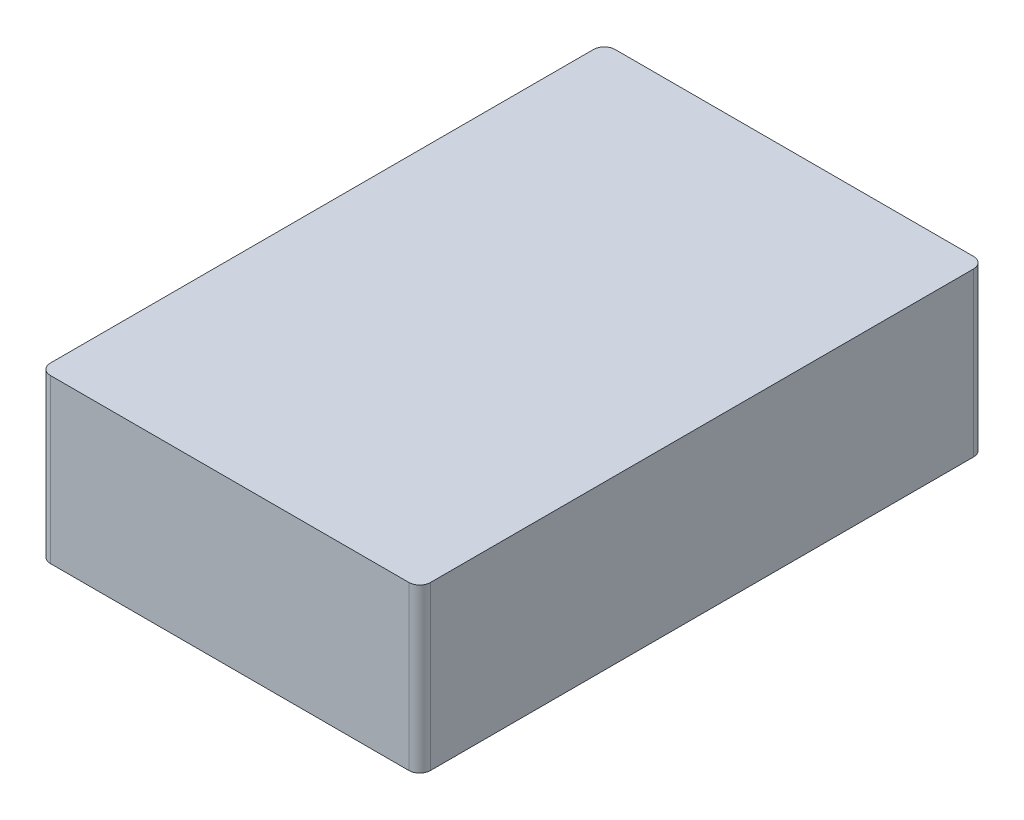
ISO-10303-21;
HEADER;
FILE_DESCRIPTION(('STEP AP214'),'2;1');
FILE_NAME('part.step','',(''),(''),'','','');
FILE_SCHEMA(('AUTOMOTIVE_DESIGN { 1 0 10303 214 1 1 1 1 }'));
ENDSEC;
DATA;
#1=APPLICATION_CONTEXT('core data for automotive mechanical design processes');
#2=APPLICATION_PROTOCOL_DEFINITION('international standard','automotive_design',2000,#1);
#3=PRODUCT_CONTEXT('',#1,'mechanical');
#4=PRODUCT('Part','Part','',(#3));
#5=PRODUCT_RELATED_PRODUCT_CATEGORY('part','',(#4));
#6=PRODUCT_DEFINITION_FORMATION('','',#4);
#7=PRODUCT_DEFINITION_CONTEXT('part definition',#1,'design');
#8=PRODUCT_DEFINITION('design','',#6,#7);
#9=PRODUCT_DEFINITION_SHAPE('','',#8);
#10=(LENGTH_UNIT() NAMED_UNIT(*) SI_UNIT(.MILLI.,.METRE.));
#11=(NAMED_UNIT(*) PLANE_ANGLE_UNIT() SI_UNIT($,.RADIAN.));
#12=(NAMED_UNIT(*) SI_UNIT($,.STERADIAN.) SOLID_ANGLE_UNIT());
#13=UNCERTAINTY_MEASURE_WITH_UNIT(LENGTH_MEASURE(1.E-05),#10,'distance_accuracy_value','');
#14=(GEOMETRIC_REPRESENTATION_CONTEXT(3) GLOBAL_UNCERTAINTY_ASSIGNED_CONTEXT((#13)) GLOBAL_UNIT_ASSIGNED_CONTEXT((#10,
#11,#12)) REPRESENTATION_CONTEXT('',''));
#15=CARTESIAN_POINT('',(0.,0.,0.));
#16=DIRECTION('',(0.,0.,1.));
#17=DIRECTION('',(1.,0.,0.));
#18=AXIS2_PLACEMENT_3D('',#15,#16,#17);
#19=CARTESIAN_POINT('',(17.5,15.,-26.));
#20=DIRECTION('',(-1.,0.,0.));
#21=DIRECTION('',(0.,0.,1.));
#22=AXIS2_PLACEMENT_3D('',#19,#20,#21);
#23=PLANE('',#22);
#24=DIRECTION('',(0.,0.,-1.));
#25=VECTOR('',#24,1.);
#26=CARTESIAN_POINT('',(17.5,0.,-26.));
#27=LINE('',#26,#25);
#28=CARTESIAN_POINT('',(17.5,0.,25.));
#29=VERTEX_POINT('',#28);
#30=CARTESIAN_POINT('',(17.5,0.,-25.));
#31=VERTEX_POINT('',#30);
#32=EDGE_CURVE('E140',#29,#31,#27,.T.);
#33=ORIENTED_EDGE('',*,*,#32,.T.);
#34=DIRECTION('',(0.,-1.,0.));
#35=VECTOR('',#34,1.);
#36=CARTESIAN_POINT('',(17.5,15.,-25.));
#37=LINE('',#36,#35);
#38=CARTESIAN_POINT('',(17.5,15.,-25.));
#39=VERTEX_POINT('',#38);
#40=EDGE_CURVE('E174',#31,#39,#37,.F.);
#41=ORIENTED_EDGE('',*,*,#40,.T.);
#42=DIRECTION('',(0.,0.,-1.));
#43=VECTOR('',#42,1.);
#44=CARTESIAN_POINT('',(17.5,15.,-26.));
#45=LINE('',#44,#43);
#46=CARTESIAN_POINT('',(17.5,15.,25.));
#47=VERTEX_POINT('',#46);
#48=EDGE_CURVE('E138',#47,#39,#45,.T.);
#49=ORIENTED_EDGE('',*,*,#48,.F.);
#50=DIRECTION('',(0.,-1.,0.));
#51=VECTOR('',#50,1.);
#52=CARTESIAN_POINT('',(17.5,15.,25.));
#53=LINE('',#52,#51);
#54=EDGE_CURVE('E170',#47,#29,#53,.T.);
#55=ORIENTED_EDGE('',*,*,#54,.T.);
#56=EDGE_LOOP('',(#33,#41,#49,#55));
#57=FACE_BOUND('',#56,.T.);
#58=ADVANCED_FACE('F39',(#57),#23,.F.);
#59=CARTESIAN_POINT('',(-17.5,15.,-26.));
#60=DIRECTION('',(0.,0.,1.));
#61=DIRECTION('',(1.,0.,0.));
#62=AXIS2_PLACEMENT_3D('',#59,#60,#61);
#63=PLANE('',#62);
#64=DIRECTION('',(-1.,0.,0.));
#65=VECTOR('',#64,1.);
#66=CARTESIAN_POINT('',(-17.5,0.,-26.));
#67=LINE('',#66,#65);
#68=CARTESIAN_POINT('',(16.5,0.,-26.));
#69=VERTEX_POINT('',#68);
#70=CARTESIAN_POINT('',(-16.5,0.,-26.));
#71=VERTEX_POINT('',#70);
#72=EDGE_CURVE('E134',#69,#71,#67,.T.);
#73=ORIENTED_EDGE('',*,*,#72,.T.);
#74=DIRECTION('',(0.,-1.,0.));
#75=VECTOR('',#74,1.);
#76=CARTESIAN_POINT('',(-16.5,15.,-26.));
#77=LINE('',#76,#75);
#78=CARTESIAN_POINT('',(-16.5,15.,-26.));
#79=VERTEX_POINT('',#78);
#80=EDGE_CURVE('E110',#71,#79,#77,.F.);
#81=ORIENTED_EDGE('',*,*,#80,.T.);
#82=DIRECTION('',(-1.,0.,0.));
#83=VECTOR('',#82,1.);
#84=CARTESIAN_POINT('',(-17.5,15.,-26.));
#85=LINE('',#84,#83);
#86=CARTESIAN_POINT('',(16.5,15.,-26.));
#87=VERTEX_POINT('',#86);
#88=EDGE_CURVE('E193',#87,#79,#85,.T.);
#89=ORIENTED_EDGE('',*,*,#88,.F.);
#90=DIRECTION('',(0.,-1.,0.));
#91=VECTOR('',#90,1.);
#92=CARTESIAN_POINT('',(16.5,15.,-26.));
#93=LINE('',#92,#91);
#94=EDGE_CURVE('E116',#87,#69,#93,.T.);
#95=ORIENTED_EDGE('',*,*,#94,.T.);
#96=EDGE_LOOP('',(#73,#81,#89,#95));
#97=FACE_BOUND('',#96,.T.);
#98=ADVANCED_FACE('F214',(#97),#63,.F.);
#99=CARTESIAN_POINT('',(-17.5,15.,-26.));
#100=DIRECTION('',(1.,0.,0.));
#101=DIRECTION('',(0.,0.,-1.));
#102=AXIS2_PLACEMENT_3D('',#99,#100,#101);
#103=PLANE('',#102);
#104=DIRECTION('',(0.,0.,1.));
#105=VECTOR('',#104,1.);
#106=CARTESIAN_POINT('',(-17.5,15.,-26.));
#107=LINE('',#106,#105);
#108=CARTESIAN_POINT('',(-17.5,15.,-25.));
#109=VERTEX_POINT('',#108);
#110=CARTESIAN_POINT('',(-17.5,15.,25.));
#111=VERTEX_POINT('',#110);
#112=EDGE_CURVE('E125',#109,#111,#107,.T.);
#113=ORIENTED_EDGE('',*,*,#112,.F.);
#114=DIRECTION('',(0.,-1.,0.));
#115=VECTOR('',#114,1.);
#116=CARTESIAN_POINT('',(-17.5,15.,-25.));
#117=LINE('',#116,#115);
#118=CARTESIAN_POINT('',(-17.5,0.,-25.));
#119=VERTEX_POINT('',#118);
#120=EDGE_CURVE('E109',#109,#119,#117,.T.);
#121=ORIENTED_EDGE('',*,*,#120,.T.);
#122=DIRECTION('',(0.,0.,1.));
#123=VECTOR('',#122,1.);
#124=CARTESIAN_POINT('',(-17.5,0.,-26.));
#125=LINE('',#124,#123);
#126=CARTESIAN_POINT('',(-17.5,0.,25.));
#127=VERTEX_POINT('',#126);
#128=EDGE_CURVE('E123',#119,#127,#125,.T.);
#129=ORIENTED_EDGE('',*,*,#128,.T.);
#130=DIRECTION('',(0.,-1.,0.));
#131=VECTOR('',#130,1.);
#132=CARTESIAN_POINT('',(-17.5,15.,25.));
#133=LINE('',#132,#131);
#134=EDGE_CURVE('E128',#127,#111,#133,.F.);
#135=ORIENTED_EDGE('',*,*,#134,.T.);
#136=EDGE_LOOP('',(#113,#121,#129,#135));
#137=FACE_BOUND('',#136,.T.);
#138=ADVANCED_FACE('F122',(#137),#103,.F.);
#139=CARTESIAN_POINT('',(-17.5,15.,26.));
#140=DIRECTION('',(0.,0.,-1.));
#141=DIRECTION('',(-1.,0.,0.));
#142=AXIS2_PLACEMENT_3D('',#139,#140,#141);
#143=PLANE('',#142);
#144=DIRECTION('',(1.,0.,0.));
#145=VECTOR('',#144,1.);
#146=CARTESIAN_POINT('',(-17.5,0.,26.));
#147=LINE('',#146,#145);
#148=CARTESIAN_POINT('',(-16.5,0.,26.));
#149=VERTEX_POINT('',#148);
#150=CARTESIAN_POINT('',(16.5,0.,26.));
#151=VERTEX_POINT('',#150);
#152=EDGE_CURVE('E133',#149,#151,#147,.T.);
#153=ORIENTED_EDGE('',*,*,#152,.T.);
#154=DIRECTION('',(0.,-1.,0.));
#155=VECTOR('',#154,1.);
#156=CARTESIAN_POINT('',(16.5,15.,26.));
#157=LINE('',#156,#155);
#158=CARTESIAN_POINT('',(16.5,15.,26.));
#159=VERTEX_POINT('',#158);
#160=EDGE_CURVE('E11',#151,#159,#157,.F.);
#161=ORIENTED_EDGE('',*,*,#160,.T.);
#162=DIRECTION('',(1.,0.,0.));
#163=VECTOR('',#162,1.);
#164=CARTESIAN_POINT('',(-17.5,15.,26.));
#165=LINE('',#164,#163);
#166=CARTESIAN_POINT('',(-16.5,15.,26.));
#167=VERTEX_POINT('',#166);
#168=EDGE_CURVE('E145',#167,#159,#165,.T.);
#169=ORIENTED_EDGE('',*,*,#168,.F.);
#170=DIRECTION('',(0.,-1.,0.));
#171=VECTOR('',#170,1.);
#172=CARTESIAN_POINT('',(-16.5,15.,26.));
#173=LINE('',#172,#171);
#174=EDGE_CURVE('E48',#167,#149,#173,.T.);
#175=ORIENTED_EDGE('',*,*,#174,.T.);
#176=EDGE_LOOP('',(#153,#161,#169,#175));
#177=FACE_BOUND('',#176,.T.);
#178=ADVANCED_FACE('F179',(#177),#143,.F.);
#179=CARTESIAN_POINT('',(0.,15.,0.));
#180=DIRECTION('',(0.,1.,0.));
#181=DIRECTION('',(0.,0.,1.));
#182=AXIS2_PLACEMENT_3D('',#179,#180,#181);
#183=PLANE('',#182);
#184=ORIENTED_EDGE('',*,*,#88,.T.);
#185=CARTESIAN_POINT('',(-16.5,15.,-25.));
#186=DIRECTION('',(0.,1.,0.));
#187=DIRECTION('',(0.,0.,1.));
#188=AXIS2_PLACEMENT_3D('',#185,#186,#187);
#189=CIRCLE('',#188,1.);
#190=EDGE_CURVE('E167',#79,#109,#189,.T.);
#191=ORIENTED_EDGE('',*,*,#190,.T.);
#192=ORIENTED_EDGE('',*,*,#112,.T.);
#193=CARTESIAN_POINT('',(-16.5,15.,25.));
#194=DIRECTION('',(0.,1.,0.));
#195=DIRECTION('',(0.,0.,1.));
#196=AXIS2_PLACEMENT_3D('',#193,#194,#195);
#197=CIRCLE('',#196,1.);
#198=EDGE_CURVE('E60',#111,#167,#197,.T.);
#199=ORIENTED_EDGE('',*,*,#198,.T.);
#200=ORIENTED_EDGE('',*,*,#168,.T.);
#201=CARTESIAN_POINT('',(16.5,15.,25.));
#202=DIRECTION('',(0.,1.,0.));
#203=DIRECTION('',(0.,0.,1.));
#204=AXIS2_PLACEMENT_3D('',#201,#202,#203);
#205=CIRCLE('',#204,1.);
#206=EDGE_CURVE('E161',#159,#47,#205,.T.);
#207=ORIENTED_EDGE('',*,*,#206,.T.);
#208=ORIENTED_EDGE('',*,*,#48,.T.);
#209=CARTESIAN_POINT('',(16.5,15.,-25.));
#210=DIRECTION('',(0.,1.,0.));
#211=DIRECTION('',(0.,0.,1.));
#212=AXIS2_PLACEMENT_3D('',#209,#210,#211);
#213=CIRCLE('',#212,1.);
#214=EDGE_CURVE('E164',#39,#87,#213,.T.);
#215=ORIENTED_EDGE('',*,*,#214,.T.);
#216=EDGE_LOOP('',(#184,#191,#192,#199,#200,#207,#208,#215));
#217=FACE_BOUND('',#216,.T.);
#218=ADVANCED_FACE('F203',(#217),#183,.T.);
#219=CARTESIAN_POINT('',(0.,0.,0.));
#220=DIRECTION('',(0.,1.,0.));
#221=DIRECTION('',(0.,0.,1.));
#222=AXIS2_PLACEMENT_3D('',#219,#220,#221);
#223=PLANE('',#222);
#224=ORIENTED_EDGE('',*,*,#128,.F.);
#225=CARTESIAN_POINT('',(-16.5,0.,-25.));
#226=DIRECTION('',(0.,1.,0.));
#227=DIRECTION('',(0.,0.,1.));
#228=AXIS2_PLACEMENT_3D('',#225,#226,#227);
#229=CIRCLE('',#228,1.);
#230=EDGE_CURVE('E105',#119,#71,#229,.F.);
#231=ORIENTED_EDGE('',*,*,#230,.T.);
#232=ORIENTED_EDGE('',*,*,#72,.F.);
#233=CARTESIAN_POINT('',(16.5,0.,-25.));
#234=DIRECTION('',(0.,1.,0.));
#235=DIRECTION('',(0.,0.,1.));
#236=AXIS2_PLACEMENT_3D('',#233,#234,#235);
#237=CIRCLE('',#236,1.);
#238=EDGE_CURVE('E117',#69,#31,#237,.F.);
#239=ORIENTED_EDGE('',*,*,#238,.T.);
#240=ORIENTED_EDGE('',*,*,#32,.F.);
#241=CARTESIAN_POINT('',(16.5,0.,25.));
#242=DIRECTION('',(0.,1.,0.));
#243=DIRECTION('',(0.,0.,1.));
#244=AXIS2_PLACEMENT_3D('',#241,#242,#243);
#245=CIRCLE('',#244,1.);
#246=EDGE_CURVE('E149',#29,#151,#245,.F.);
#247=ORIENTED_EDGE('',*,*,#246,.T.);
#248=ORIENTED_EDGE('',*,*,#152,.F.);
#249=CARTESIAN_POINT('',(-16.5,0.,25.));
#250=DIRECTION('',(0.,1.,0.));
#251=DIRECTION('',(0.,0.,1.));
#252=AXIS2_PLACEMENT_3D('',#249,#250,#251);
#253=CIRCLE('',#252,1.);
#254=EDGE_CURVE('E127',#149,#127,#253,.F.);
#255=ORIENTED_EDGE('',*,*,#254,.T.);
#256=EDGE_LOOP('',(#224,#231,#232,#239,#240,#247,#248,#255));
#257=FACE_BOUND('',#256,.T.);
#258=ADVANCED_FACE('F130',(#257),#223,.F.);
#259=CARTESIAN_POINT('',(-16.5,15.,-25.));
#260=DIRECTION('',(0.,-1.,0.));
#261=DIRECTION('',(0.,0.,-1.));
#262=AXIS2_PLACEMENT_3D('',#259,#260,#261);
#263=CYLINDRICAL_SURFACE('',#262,1.);
#264=ORIENTED_EDGE('',*,*,#190,.F.);
#265=ORIENTED_EDGE('',*,*,#80,.F.);
#266=ORIENTED_EDGE('',*,*,#230,.F.);
#267=ORIENTED_EDGE('',*,*,#120,.F.);
#268=EDGE_LOOP('',(#264,#265,#266,#267));
#269=FACE_BOUND('',#268,.T.);
#270=ADVANCED_FACE('F108',(#269),#263,.T.);
#271=CARTESIAN_POINT('',(16.5,15.,-25.));
#272=DIRECTION('',(0.,-1.,0.));
#273=DIRECTION('',(0.,0.,-1.));
#274=AXIS2_PLACEMENT_3D('',#271,#272,#273);
#275=CYLINDRICAL_SURFACE('',#274,1.);
#276=ORIENTED_EDGE('',*,*,#214,.F.);
#277=ORIENTED_EDGE('',*,*,#40,.F.);
#278=ORIENTED_EDGE('',*,*,#238,.F.);
#279=ORIENTED_EDGE('',*,*,#94,.F.);
#280=EDGE_LOOP('',(#276,#277,#278,#279));
#281=FACE_BOUND('',#280,.T.);
#282=ADVANCED_FACE('F225',(#281),#275,.T.);
#283=CARTESIAN_POINT('',(16.5,15.,25.));
#284=DIRECTION('',(0.,-1.,0.));
#285=DIRECTION('',(0.,0.,-1.));
#286=AXIS2_PLACEMENT_3D('',#283,#284,#285);
#287=CYLINDRICAL_SURFACE('',#286,1.);
#288=ORIENTED_EDGE('',*,*,#206,.F.);
#289=ORIENTED_EDGE('',*,*,#160,.F.);
#290=ORIENTED_EDGE('',*,*,#246,.F.);
#291=ORIENTED_EDGE('',*,*,#54,.F.);
#292=EDGE_LOOP('',(#288,#289,#290,#291));
#293=FACE_BOUND('',#292,.T.);
#294=ADVANCED_FACE('F186',(#293),#287,.T.);
#295=CARTESIAN_POINT('',(-16.5,15.,25.));
#296=DIRECTION('',(0.,-1.,0.));
#297=DIRECTION('',(0.,0.,-1.));
#298=AXIS2_PLACEMENT_3D('',#295,#296,#297);
#299=CYLINDRICAL_SURFACE('',#298,1.);
#300=ORIENTED_EDGE('',*,*,#198,.F.);
#301=ORIENTED_EDGE('',*,*,#134,.F.);
#302=ORIENTED_EDGE('',*,*,#254,.F.);
#303=ORIENTED_EDGE('',*,*,#174,.F.);
#304=EDGE_LOOP('',(#300,#301,#302,#303));
#305=FACE_BOUND('',#304,.T.);
#306=ADVANCED_FACE('F41',(#305),#299,.T.);
#307=CLOSED_SHELL('',(#58,#98,#138,#178,#218,#258,#270,#282,#294,#306));
#308=MANIFOLD_SOLID_BREP('B2',#307);
#309=ADVANCED_BREP_SHAPE_REPRESENTATION('',(#18,#308),#14);
#310=SHAPE_DEFINITION_REPRESENTATION(#9,#309);
ENDSEC;
END-ISO-10303-21;
